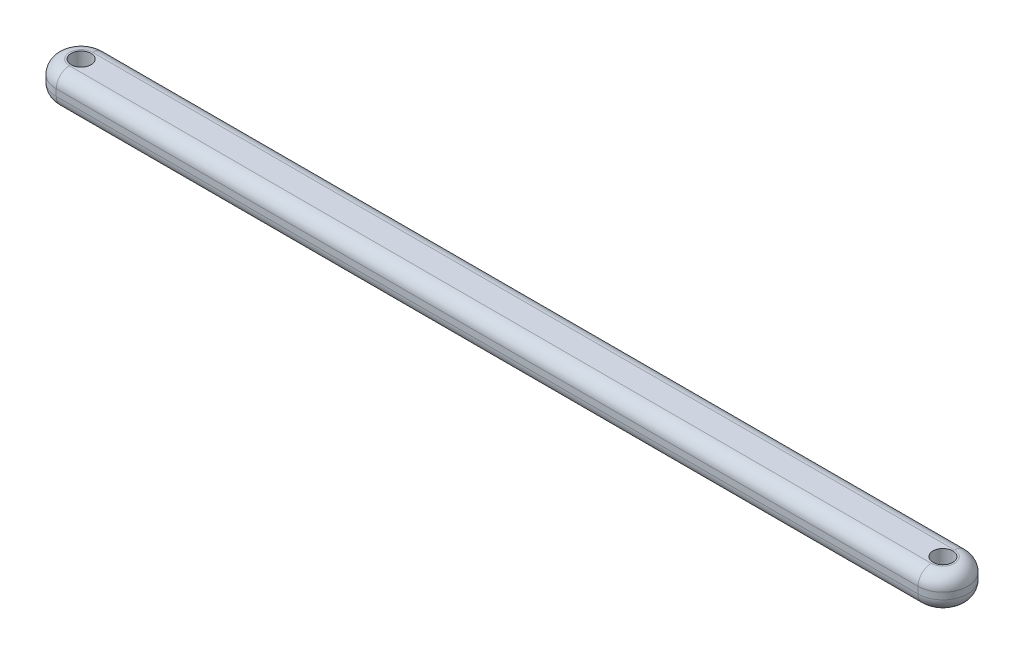
ISO-10303-21;
HEADER;
FILE_DESCRIPTION(('STEP AP214'),'2;1');
FILE_NAME('part.step','',(''),(''),'','','');
FILE_SCHEMA(('AUTOMOTIVE_DESIGN { 1 0 10303 214 1 1 1 1 }'));
ENDSEC;
DATA;
#1=APPLICATION_CONTEXT('core data for automotive mechanical design processes');
#2=APPLICATION_PROTOCOL_DEFINITION('international standard','automotive_design',2000,#1);
#3=PRODUCT_CONTEXT('',#1,'mechanical');
#4=PRODUCT('Part','Part','',(#3));
#5=PRODUCT_RELATED_PRODUCT_CATEGORY('part','',(#4));
#6=PRODUCT_DEFINITION_FORMATION('','',#4);
#7=PRODUCT_DEFINITION_CONTEXT('part definition',#1,'design');
#8=PRODUCT_DEFINITION('design','',#6,#7);
#9=PRODUCT_DEFINITION_SHAPE('','',#8);
#10=(LENGTH_UNIT() NAMED_UNIT(*) SI_UNIT(.MILLI.,.METRE.));
#11=(NAMED_UNIT(*) PLANE_ANGLE_UNIT() SI_UNIT($,.RADIAN.));
#12=(NAMED_UNIT(*) SI_UNIT($,.STERADIAN.) SOLID_ANGLE_UNIT());
#13=UNCERTAINTY_MEASURE_WITH_UNIT(LENGTH_MEASURE(1.E-05),#10,'distance_accuracy_value','');
#14=(GEOMETRIC_REPRESENTATION_CONTEXT(3) GLOBAL_UNCERTAINTY_ASSIGNED_CONTEXT((#13)) GLOBAL_UNIT_ASSIGNED_CONTEXT((#10,
#11,#12)) REPRESENTATION_CONTEXT('',''));
#15=CARTESIAN_POINT('',(0.,0.,0.));
#16=DIRECTION('',(0.,0.,1.));
#17=DIRECTION('',(1.,0.,0.));
#18=AXIS2_PLACEMENT_3D('',#15,#16,#17);
#19=CARTESIAN_POINT('',(-260.,5.,0.));
#20=DIRECTION('',(0.,1.,0.));
#21=DIRECTION('',(0.,0.,1.));
#22=AXIS2_PLACEMENT_3D('',#19,#20,#21);
#23=PLANE('',#22);
#24=DIRECTION('',(1.,0.,0.));
#25=VECTOR('',#24,1.);
#26=CARTESIAN_POINT('',(0.,5.,3.5));
#27=LINE('',#26,#25);
#28=CARTESIAN_POINT('',(-260.,5.,3.5));
#29=VERTEX_POINT('',#28);
#30=CARTESIAN_POINT('',(0.,5.,3.5));
#31=VERTEX_POINT('',#30);
#32=EDGE_CURVE('E131',#29,#31,#27,.T.);
#33=ORIENTED_EDGE('',*,*,#32,.T.);
#34=CARTESIAN_POINT('',(0.,5.,0.));
#35=DIRECTION('',(0.,1.,0.));
#36=DIRECTION('',(0.,0.,1.));
#37=AXIS2_PLACEMENT_3D('',#34,#35,#36);
#38=CIRCLE('',#37,3.5);
#39=CARTESIAN_POINT('',(0.,5.,-3.5));
#40=VERTEX_POINT('',#39);
#41=EDGE_CURVE('E112',#31,#40,#38,.T.);
#42=ORIENTED_EDGE('',*,*,#41,.T.);
#43=DIRECTION('',(-1.,0.,0.));
#44=VECTOR('',#43,1.);
#45=CARTESIAN_POINT('',(-260.,5.,-3.5));
#46=LINE('',#45,#44);
#47=CARTESIAN_POINT('',(-260.,5.,-3.5));
#48=VERTEX_POINT('',#47);
#49=EDGE_CURVE('E120',#40,#48,#46,.T.);
#50=ORIENTED_EDGE('',*,*,#49,.T.);
#51=CARTESIAN_POINT('',(-260.,5.,0.));
#52=DIRECTION('',(0.,1.,0.));
#53=DIRECTION('',(0.,0.,1.));
#54=AXIS2_PLACEMENT_3D('',#51,#52,#53);
#55=CIRCLE('',#54,3.5);
#56=EDGE_CURVE('E126',#48,#29,#55,.T.);
#57=ORIENTED_EDGE('',*,*,#56,.T.);
#58=EDGE_LOOP('',(#33,#42,#50,#57));
#59=FACE_BOUND('',#58,.T.);
#60=CARTESIAN_POINT('',(0.,5.,0.));
#61=DIRECTION('',(0.,1.,0.));
#62=DIRECTION('',(0.,0.,1.));
#63=AXIS2_PLACEMENT_3D('',#60,#61,#62);
#64=CIRCLE('',#63,3.);
#65=CARTESIAN_POINT('',(0.,5.,3.));
#66=VERTEX_POINT('',#65);
#67=EDGE_CURVE('E198',#66,#66,#64,.T.);
#68=ORIENTED_EDGE('',*,*,#67,.F.);
#69=EDGE_LOOP('',(#68));
#70=FACE_BOUND('',#69,.T.);
#71=CARTESIAN_POINT('',(-260.,5.,0.));
#72=DIRECTION('',(0.,1.,0.));
#73=DIRECTION('',(0.,0.,1.));
#74=AXIS2_PLACEMENT_3D('',#71,#72,#73);
#75=CIRCLE('',#74,2.99999999999999);
#76=CARTESIAN_POINT('',(-260.,5.,2.99999999999999));
#77=VERTEX_POINT('',#76);
#78=EDGE_CURVE('E351',#77,#77,#75,.T.);
#79=ORIENTED_EDGE('',*,*,#78,.F.);
#80=EDGE_LOOP('',(#79));
#81=FACE_BOUND('',#80,.T.);
#82=ADVANCED_FACE('F39',(#59,#70,#81),#23,.T.);
#83=CARTESIAN_POINT('',(-260.,-5.,0.));
#84=DIRECTION('',(0.,1.,0.));
#85=DIRECTION('',(0.,0.,1.));
#86=AXIS2_PLACEMENT_3D('',#83,#84,#85);
#87=PLANE('',#86);
#88=DIRECTION('',(-1.,0.,0.));
#89=VECTOR('',#88,1.);
#90=CARTESIAN_POINT('',(-260.,-5.,-3.5));
#91=LINE('',#90,#89);
#92=CARTESIAN_POINT('',(-260.,-5.,-3.5));
#93=VERTEX_POINT('',#92);
#94=CARTESIAN_POINT('',(0.,-5.,-3.5));
#95=VERTEX_POINT('',#94);
#96=EDGE_CURVE('E149',#93,#95,#91,.F.);
#97=ORIENTED_EDGE('',*,*,#96,.T.);
#98=CARTESIAN_POINT('',(0.,-5.,0.));
#99=DIRECTION('',(0.,1.,0.));
#100=DIRECTION('',(0.,0.,1.));
#101=AXIS2_PLACEMENT_3D('',#98,#99,#100);
#102=CIRCLE('',#101,3.5);
#103=CARTESIAN_POINT('',(0.,-5.,3.5));
#104=VERTEX_POINT('',#103);
#105=EDGE_CURVE('E154',#95,#104,#102,.F.);
#106=ORIENTED_EDGE('',*,*,#105,.T.);
#107=DIRECTION('',(1.,0.,0.));
#108=VECTOR('',#107,1.);
#109=CARTESIAN_POINT('',(-260.,-5.,3.5));
#110=LINE('',#109,#108);
#111=CARTESIAN_POINT('',(-260.,-5.,3.5));
#112=VERTEX_POINT('',#111);
#113=EDGE_CURVE('E63',#104,#112,#110,.F.);
#114=ORIENTED_EDGE('',*,*,#113,.T.);
#115=CARTESIAN_POINT('',(-260.,-5.,0.));
#116=DIRECTION('',(0.,1.,0.));
#117=DIRECTION('',(0.,0.,1.));
#118=AXIS2_PLACEMENT_3D('',#115,#116,#117);
#119=CIRCLE('',#118,3.5);
#120=EDGE_CURVE('E151',#112,#93,#119,.F.);
#121=ORIENTED_EDGE('',*,*,#120,.T.);
#122=EDGE_LOOP('',(#97,#106,#114,#121));
#123=FACE_BOUND('',#122,.T.);
#124=CARTESIAN_POINT('',(0.,-5.,0.));
#125=DIRECTION('',(0.,1.,0.));
#126=DIRECTION('',(0.,0.,1.));
#127=AXIS2_PLACEMENT_3D('',#124,#125,#126);
#128=CIRCLE('',#127,3.);
#129=CARTESIAN_POINT('',(0.,-5.,3.));
#130=VERTEX_POINT('',#129);
#131=EDGE_CURVE('E350',#130,#130,#128,.T.);
#132=ORIENTED_EDGE('',*,*,#131,.T.);
#133=EDGE_LOOP('',(#132));
#134=FACE_BOUND('',#133,.T.);
#135=CARTESIAN_POINT('',(-260.,-5.,0.));
#136=DIRECTION('',(0.,1.,0.));
#137=DIRECTION('',(0.,0.,1.));
#138=AXIS2_PLACEMENT_3D('',#135,#136,#137);
#139=CIRCLE('',#138,2.99999999999999);
#140=CARTESIAN_POINT('',(-260.,-5.,2.99999999999999));
#141=VERTEX_POINT('',#140);
#142=EDGE_CURVE('E162',#141,#141,#139,.T.);
#143=ORIENTED_EDGE('',*,*,#142,.T.);
#144=EDGE_LOOP('',(#143));
#145=FACE_BOUND('',#144,.T.);
#146=ADVANCED_FACE('F178',(#123,#134,#145),#87,.F.);
#147=CARTESIAN_POINT('',(-260.,5.,0.));
#148=DIRECTION('',(0.,-1.,0.));
#149=DIRECTION('',(0.,0.,-1.));
#150=AXIS2_PLACEMENT_3D('',#147,#148,#149);
#151=CYLINDRICAL_SURFACE('',#150,7.5);
#152=DIRECTION('',(0.,-1.,0.));
#153=VECTOR('',#152,1.);
#154=CARTESIAN_POINT('',(-260.,5.,7.5));
#155=LINE('',#154,#153);
#156=CARTESIAN_POINT('',(-260.,1.,7.5));
#157=VERTEX_POINT('',#156);
#158=CARTESIAN_POINT('',(-260.,-1.,7.5));
#159=VERTEX_POINT('',#158);
#160=EDGE_CURVE('E127',#157,#159,#155,.T.);
#161=ORIENTED_EDGE('',*,*,#160,.F.);
#162=CARTESIAN_POINT('',(-260.,1.,0.));
#163=DIRECTION('',(0.,1.,0.));
#164=DIRECTION('',(0.,0.,1.));
#165=AXIS2_PLACEMENT_3D('',#162,#163,#164);
#166=CIRCLE('',#165,7.5);
#167=CARTESIAN_POINT('',(-260.,1.,-7.5));
#168=VERTEX_POINT('',#167);
#169=EDGE_CURVE('E147',#157,#168,#166,.F.);
#170=ORIENTED_EDGE('',*,*,#169,.T.);
#171=DIRECTION('',(0.,-1.,0.));
#172=VECTOR('',#171,1.);
#173=CARTESIAN_POINT('',(-260.,5.,-7.5));
#174=LINE('',#173,#172);
#175=CARTESIAN_POINT('',(-260.,-1.,-7.5));
#176=VERTEX_POINT('',#175);
#177=EDGE_CURVE('E195',#168,#176,#174,.T.);
#178=ORIENTED_EDGE('',*,*,#177,.T.);
#179=CARTESIAN_POINT('',(-260.,-1.,0.));
#180=DIRECTION('',(0.,1.,0.));
#181=DIRECTION('',(0.,0.,1.));
#182=AXIS2_PLACEMENT_3D('',#179,#180,#181);
#183=CIRCLE('',#182,7.5);
#184=EDGE_CURVE('E145',#176,#159,#183,.T.);
#185=ORIENTED_EDGE('',*,*,#184,.T.);
#186=EDGE_LOOP('',(#161,#170,#178,#185));
#187=FACE_BOUND('',#186,.T.);
#188=ADVANCED_FACE('F214',(#187),#151,.T.);
#189=CARTESIAN_POINT('',(-260.,5.,7.5));
#190=DIRECTION('',(0.,0.,-1.));
#191=DIRECTION('',(-1.,0.,0.));
#192=AXIS2_PLACEMENT_3D('',#189,#190,#191);
#193=PLANE('',#192);
#194=DIRECTION('',(0.,-1.,0.));
#195=VECTOR('',#194,1.);
#196=CARTESIAN_POINT('',(0.,5.,7.5));
#197=LINE('',#196,#195);
#198=CARTESIAN_POINT('',(0.,1.,7.5));
#199=VERTEX_POINT('',#198);
#200=CARTESIAN_POINT('',(0.,-1.,7.5));
#201=VERTEX_POINT('',#200);
#202=EDGE_CURVE('E193',#199,#201,#197,.T.);
#203=ORIENTED_EDGE('',*,*,#202,.F.);
#204=DIRECTION('',(1.,0.,0.));
#205=VECTOR('',#204,1.);
#206=CARTESIAN_POINT('',(-260.,1.,7.5));
#207=LINE('',#206,#205);
#208=EDGE_CURVE('E143',#199,#157,#207,.F.);
#209=ORIENTED_EDGE('',*,*,#208,.T.);
#210=ORIENTED_EDGE('',*,*,#160,.T.);
#211=DIRECTION('',(1.,0.,0.));
#212=VECTOR('',#211,1.);
#213=CARTESIAN_POINT('',(-260.,-1.,7.5));
#214=LINE('',#213,#212);
#215=EDGE_CURVE('E141',#159,#201,#214,.T.);
#216=ORIENTED_EDGE('',*,*,#215,.T.);
#217=EDGE_LOOP('',(#203,#209,#210,#216));
#218=FACE_BOUND('',#217,.T.);
#219=ADVANCED_FACE('F212',(#218),#193,.F.);
#220=CARTESIAN_POINT('',(0.,5.,0.));
#221=DIRECTION('',(0.,-1.,0.));
#222=DIRECTION('',(0.,0.,-1.));
#223=AXIS2_PLACEMENT_3D('',#220,#221,#222);
#224=CYLINDRICAL_SURFACE('',#223,7.5);
#225=DIRECTION('',(0.,-1.,0.));
#226=VECTOR('',#225,1.);
#227=CARTESIAN_POINT('',(0.,5.,-7.5));
#228=LINE('',#227,#226);
#229=CARTESIAN_POINT('',(0.,1.,-7.5));
#230=VERTEX_POINT('',#229);
#231=CARTESIAN_POINT('',(0.,-1.,-7.5));
#232=VERTEX_POINT('',#231);
#233=EDGE_CURVE('E191',#230,#232,#228,.T.);
#234=ORIENTED_EDGE('',*,*,#233,.F.);
#235=CARTESIAN_POINT('',(0.,1.,0.));
#236=DIRECTION('',(0.,1.,0.));
#237=DIRECTION('',(0.,0.,1.));
#238=AXIS2_PLACEMENT_3D('',#235,#236,#237);
#239=CIRCLE('',#238,7.5);
#240=EDGE_CURVE('E114',#230,#199,#239,.F.);
#241=ORIENTED_EDGE('',*,*,#240,.T.);
#242=ORIENTED_EDGE('',*,*,#202,.T.);
#243=CARTESIAN_POINT('',(0.,-1.,0.));
#244=DIRECTION('',(0.,1.,0.));
#245=DIRECTION('',(0.,0.,1.));
#246=AXIS2_PLACEMENT_3D('',#243,#244,#245);
#247=CIRCLE('',#246,7.5);
#248=EDGE_CURVE('E133',#201,#232,#247,.T.);
#249=ORIENTED_EDGE('',*,*,#248,.T.);
#250=EDGE_LOOP('',(#234,#241,#242,#249));
#251=FACE_BOUND('',#250,.T.);
#252=ADVANCED_FACE('F190',(#251),#224,.T.);
#253=CARTESIAN_POINT('',(0.,5.,-7.5));
#254=DIRECTION('',(0.,0.,1.));
#255=DIRECTION('',(1.,0.,0.));
#256=AXIS2_PLACEMENT_3D('',#253,#254,#255);
#257=PLANE('',#256);
#258=ORIENTED_EDGE('',*,*,#177,.F.);
#259=DIRECTION('',(-1.,0.,0.));
#260=VECTOR('',#259,1.);
#261=CARTESIAN_POINT('',(0.,1.,-7.5));
#262=LINE('',#261,#260);
#263=EDGE_CURVE('E11',#168,#230,#262,.F.);
#264=ORIENTED_EDGE('',*,*,#263,.T.);
#265=ORIENTED_EDGE('',*,*,#233,.T.);
#266=DIRECTION('',(-1.,0.,0.));
#267=VECTOR('',#266,1.);
#268=CARTESIAN_POINT('',(0.,-1.,-7.5));
#269=LINE('',#268,#267);
#270=EDGE_CURVE('E48',#232,#176,#269,.T.);
#271=ORIENTED_EDGE('',*,*,#270,.T.);
#272=EDGE_LOOP('',(#258,#264,#265,#271));
#273=FACE_BOUND('',#272,.T.);
#274=ADVANCED_FACE('F194',(#273),#257,.F.);
#275=CARTESIAN_POINT('',(0.,5.,0.));
#276=DIRECTION('',(0.,-1.,0.));
#277=DIRECTION('',(0.,0.,-1.));
#278=AXIS2_PLACEMENT_3D('',#275,#276,#277);
#279=CYLINDRICAL_SURFACE('',#278,3.);
#280=ORIENTED_EDGE('',*,*,#67,.T.);
#281=EDGE_LOOP('',(#280));
#282=FACE_BOUND('',#281,.T.);
#283=ORIENTED_EDGE('',*,*,#131,.F.);
#284=EDGE_LOOP('',(#283));
#285=FACE_BOUND('',#284,.T.);
#286=ADVANCED_FACE('F230',(#282,#285),#279,.F.);
#287=CARTESIAN_POINT('',(-260.,5.,0.));
#288=DIRECTION('',(0.,-1.,0.));
#289=DIRECTION('',(0.,0.,-1.));
#290=AXIS2_PLACEMENT_3D('',#287,#288,#289);
#291=CYLINDRICAL_SURFACE('',#290,2.99999999999999);
#292=ORIENTED_EDGE('',*,*,#78,.T.);
#293=EDGE_LOOP('',(#292));
#294=FACE_BOUND('',#293,.T.);
#295=ORIENTED_EDGE('',*,*,#142,.F.);
#296=EDGE_LOOP('',(#295));
#297=FACE_BOUND('',#296,.T.);
#298=ADVANCED_FACE('F253',(#294,#297),#291,.F.);
#299=CARTESIAN_POINT('',(-260.,1.,0.));
#300=DIRECTION('',(0.,1.,0.));
#301=DIRECTION('',(0.,0.,1.));
#302=AXIS2_PLACEMENT_3D('',#299,#300,#301);
#303=DEGENERATE_TOROIDAL_SURFACE('',#302,3.5,4.,.T.);
#304=CARTESIAN_POINT('',(-260.,1.,-3.5));
#305=DIRECTION('',(1.,0.,0.));
#306=DIRECTION('',(0.,0.,-1.));
#307=AXIS2_PLACEMENT_3D('',#304,#305,#306);
#308=CIRCLE('',#307,4.);
#309=EDGE_CURVE('E123',#168,#48,#308,.T.);
#310=ORIENTED_EDGE('',*,*,#309,.F.);
#311=ORIENTED_EDGE('',*,*,#169,.F.);
#312=CARTESIAN_POINT('',(-260.,1.,3.5));
#313=DIRECTION('',(1.,0.,0.));
#314=DIRECTION('',(0.,0.,-1.));
#315=AXIS2_PLACEMENT_3D('',#312,#313,#314);
#316=CIRCLE('',#315,4.);
#317=EDGE_CURVE('E159',#29,#157,#316,.T.);
#318=ORIENTED_EDGE('',*,*,#317,.F.);
#319=ORIENTED_EDGE('',*,*,#56,.F.);
#320=EDGE_LOOP('',(#310,#311,#318,#319));
#321=FACE_BOUND('',#320,.T.);
#322=ADVANCED_FACE('F206',(#321),#303,.T.);
#323=CARTESIAN_POINT('',(-260.,1.,3.5));
#324=DIRECTION('',(-1.,0.,0.));
#325=DIRECTION('',(0.,0.,1.));
#326=AXIS2_PLACEMENT_3D('',#323,#324,#325);
#327=CYLINDRICAL_SURFACE('',#326,4.);
#328=ORIENTED_EDGE('',*,*,#317,.T.);
#329=ORIENTED_EDGE('',*,*,#208,.F.);
#330=CARTESIAN_POINT('',(0.,1.,3.5));
#331=DIRECTION('',(1.,0.,0.));
#332=DIRECTION('',(0.,0.,-1.));
#333=AXIS2_PLACEMENT_3D('',#330,#331,#332);
#334=CIRCLE('',#333,4.);
#335=EDGE_CURVE('E117',#31,#199,#334,.T.);
#336=ORIENTED_EDGE('',*,*,#335,.F.);
#337=ORIENTED_EDGE('',*,*,#32,.F.);
#338=EDGE_LOOP('',(#328,#329,#336,#337));
#339=FACE_BOUND('',#338,.T.);
#340=ADVANCED_FACE('F209',(#339),#327,.T.);
#341=CARTESIAN_POINT('',(-260.,1.,-3.5));
#342=DIRECTION('',(1.,0.,0.));
#343=DIRECTION('',(0.,0.,-1.));
#344=AXIS2_PLACEMENT_3D('',#341,#342,#343);
#345=CYLINDRICAL_SURFACE('',#344,4.);
#346=ORIENTED_EDGE('',*,*,#309,.T.);
#347=ORIENTED_EDGE('',*,*,#49,.F.);
#348=CARTESIAN_POINT('',(0.,1.,-3.5));
#349=DIRECTION('',(1.,0.,0.));
#350=DIRECTION('',(0.,0.,-1.));
#351=AXIS2_PLACEMENT_3D('',#348,#349,#350);
#352=CIRCLE('',#351,4.);
#353=EDGE_CURVE('E108',#230,#40,#352,.T.);
#354=ORIENTED_EDGE('',*,*,#353,.F.);
#355=ORIENTED_EDGE('',*,*,#263,.F.);
#356=EDGE_LOOP('',(#346,#347,#354,#355));
#357=FACE_BOUND('',#356,.T.);
#358=ADVANCED_FACE('F121',(#357),#345,.T.);
#359=CARTESIAN_POINT('',(0.,1.,0.));
#360=DIRECTION('',(0.,1.,0.));
#361=DIRECTION('',(0.,0.,1.));
#362=AXIS2_PLACEMENT_3D('',#359,#360,#361);
#363=DEGENERATE_TOROIDAL_SURFACE('',#362,3.5,4.,.T.);
#364=ORIENTED_EDGE('',*,*,#335,.T.);
#365=ORIENTED_EDGE('',*,*,#240,.F.);
#366=ORIENTED_EDGE('',*,*,#353,.T.);
#367=ORIENTED_EDGE('',*,*,#41,.F.);
#368=EDGE_LOOP('',(#364,#365,#366,#367));
#369=FACE_BOUND('',#368,.T.);
#370=ADVANCED_FACE('F110',(#369),#363,.T.);
#371=CARTESIAN_POINT('',(-260.,-1.,0.));
#372=DIRECTION('',(0.,1.,0.));
#373=DIRECTION('',(0.,0.,1.));
#374=AXIS2_PLACEMENT_3D('',#371,#372,#373);
#375=DEGENERATE_TOROIDAL_SURFACE('',#374,3.5,4.,.T.);
#376=CARTESIAN_POINT('',(-260.,-1.,-3.5));
#377=DIRECTION('',(1.,0.,0.));
#378=DIRECTION('',(0.,0.,-1.));
#379=AXIS2_PLACEMENT_3D('',#376,#377,#378);
#380=CIRCLE('',#379,4.);
#381=EDGE_CURVE('E165',#93,#176,#380,.T.);
#382=ORIENTED_EDGE('',*,*,#381,.F.);
#383=ORIENTED_EDGE('',*,*,#120,.F.);
#384=CARTESIAN_POINT('',(-260.,-1.,3.5));
#385=DIRECTION('',(1.,0.,0.));
#386=DIRECTION('',(0.,0.,-1.));
#387=AXIS2_PLACEMENT_3D('',#384,#385,#386);
#388=CIRCLE('',#387,4.);
#389=EDGE_CURVE('E43',#159,#112,#388,.T.);
#390=ORIENTED_EDGE('',*,*,#389,.F.);
#391=ORIENTED_EDGE('',*,*,#184,.F.);
#392=EDGE_LOOP('',(#382,#383,#390,#391));
#393=FACE_BOUND('',#392,.T.);
#394=ADVANCED_FACE('F41',(#393),#375,.T.);
#395=CARTESIAN_POINT('',(-260.,-1.,3.5));
#396=DIRECTION('',(1.,0.,0.));
#397=DIRECTION('',(0.,0.,-1.));
#398=AXIS2_PLACEMENT_3D('',#395,#396,#397);
#399=CYLINDRICAL_SURFACE('',#398,4.);
#400=ORIENTED_EDGE('',*,*,#389,.T.);
#401=ORIENTED_EDGE('',*,*,#113,.F.);
#402=CARTESIAN_POINT('',(0.,-1.,3.5));
#403=DIRECTION('',(1.,0.,0.));
#404=DIRECTION('',(0.,1.,0.));
#405=AXIS2_PLACEMENT_3D('',#402,#403,#404);
#406=CIRCLE('',#405,4.);
#407=EDGE_CURVE('E56',#201,#104,#406,.T.);
#408=ORIENTED_EDGE('',*,*,#407,.F.);
#409=ORIENTED_EDGE('',*,*,#215,.F.);
#410=EDGE_LOOP('',(#400,#401,#408,#409));
#411=FACE_BOUND('',#410,.T.);
#412=ADVANCED_FACE('F175',(#411),#399,.T.);
#413=CARTESIAN_POINT('',(0.,-1.,-3.5));
#414=DIRECTION('',(-1.,0.,0.));
#415=DIRECTION('',(0.,0.,1.));
#416=AXIS2_PLACEMENT_3D('',#413,#414,#415);
#417=CYLINDRICAL_SURFACE('',#416,4.);
#418=ORIENTED_EDGE('',*,*,#381,.T.);
#419=ORIENTED_EDGE('',*,*,#270,.F.);
#420=CARTESIAN_POINT('',(0.,-1.,-3.5));
#421=DIRECTION('',(1.,0.,0.));
#422=DIRECTION('',(0.,0.,-1.));
#423=AXIS2_PLACEMENT_3D('',#420,#421,#422);
#424=CIRCLE('',#423,4.);
#425=EDGE_CURVE('E163',#95,#232,#424,.T.);
#426=ORIENTED_EDGE('',*,*,#425,.F.);
#427=ORIENTED_EDGE('',*,*,#96,.F.);
#428=EDGE_LOOP('',(#418,#419,#426,#427));
#429=FACE_BOUND('',#428,.T.);
#430=ADVANCED_FACE('F182',(#429),#417,.T.);
#431=CARTESIAN_POINT('',(0.,-1.,0.));
#432=DIRECTION('',(0.,1.,0.));
#433=DIRECTION('',(0.,0.,1.));
#434=AXIS2_PLACEMENT_3D('',#431,#432,#433);
#435=DEGENERATE_TOROIDAL_SURFACE('',#434,3.5,4.,.T.);
#436=ORIENTED_EDGE('',*,*,#407,.T.);
#437=ORIENTED_EDGE('',*,*,#105,.F.);
#438=ORIENTED_EDGE('',*,*,#425,.T.);
#439=ORIENTED_EDGE('',*,*,#248,.F.);
#440=EDGE_LOOP('',(#436,#437,#438,#439));
#441=FACE_BOUND('',#440,.T.);
#442=ADVANCED_FACE('F181',(#441),#435,.T.);
#443=CLOSED_SHELL('',(#82,#146,#188,#219,#252,#274,#286,#298,#322,#340,#358,#370,#394,#412,#430,#442));
#444=MANIFOLD_SOLID_BREP('B2',#443);
#445=ADVANCED_BREP_SHAPE_REPRESENTATION('',(#18,#444),#14);
#446=SHAPE_DEFINITION_REPRESENTATION(#9,#445);
ENDSEC;
END-ISO-10303-21;
